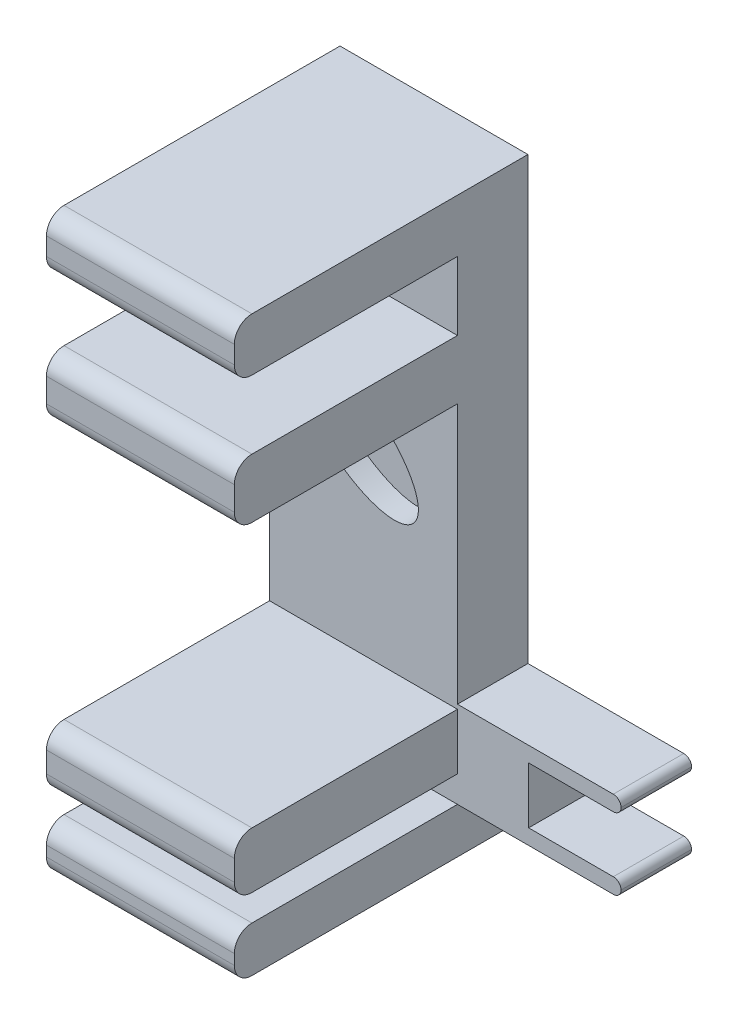
ISO-10303-21;
HEADER;
FILE_DESCRIPTION(('STEP AP214'),'2;1');
FILE_NAME('part.step','',(''),(''),'','','');
FILE_SCHEMA(('AUTOMOTIVE_DESIGN { 1 0 10303 214 1 1 1 1 }'));
ENDSEC;
DATA;
#1=APPLICATION_CONTEXT('core data for automotive mechanical design processes');
#2=APPLICATION_PROTOCOL_DEFINITION('international standard','automotive_design',2000,#1);
#3=PRODUCT_CONTEXT('',#1,'mechanical');
#4=PRODUCT('Part','Part','',(#3));
#5=PRODUCT_RELATED_PRODUCT_CATEGORY('part','',(#4));
#6=PRODUCT_DEFINITION_FORMATION('','',#4);
#7=PRODUCT_DEFINITION_CONTEXT('part definition',#1,'design');
#8=PRODUCT_DEFINITION('design','',#6,#7);
#9=PRODUCT_DEFINITION_SHAPE('','',#8);
#10=(LENGTH_UNIT() NAMED_UNIT(*) SI_UNIT(.MILLI.,.METRE.));
#11=(NAMED_UNIT(*) PLANE_ANGLE_UNIT() SI_UNIT($,.RADIAN.));
#12=(NAMED_UNIT(*) SI_UNIT($,.STERADIAN.) SOLID_ANGLE_UNIT());
#13=UNCERTAINTY_MEASURE_WITH_UNIT(LENGTH_MEASURE(1.E-05),#10,'distance_accuracy_value','');
#14=(GEOMETRIC_REPRESENTATION_CONTEXT(3) GLOBAL_UNCERTAINTY_ASSIGNED_CONTEXT((#13)) GLOBAL_UNIT_ASSIGNED_CONTEXT((#10,
#11,#12)) REPRESENTATION_CONTEXT('',''));
#15=CARTESIAN_POINT('',(0.,0.,0.));
#16=DIRECTION('',(0.,0.,1.));
#17=DIRECTION('',(1.,0.,0.));
#18=AXIS2_PLACEMENT_3D('',#15,#16,#17);
#19=CARTESIAN_POINT('',(0.,0.,15.));
#20=DIRECTION('',(0.,0.,1.));
#21=DIRECTION('',(1.,0.,0.));
#22=AXIS2_PLACEMENT_3D('',#19,#20,#21);
#23=PLANE('',#22);
#24=CARTESIAN_POINT('',(37.0689794079835,133.739472918689,15.));
#25=DIRECTION('',(0.,0.,1.));
#26=DIRECTION('',(0.778753909083282,-0.627329537872646,0.));
#27=AXIS2_PLACEMENT_3D('',#24,#25,#26);
#28=ELLIPSE('',#27,31.4602203387693,15.1854081794294);
#29=CARTESIAN_POINT('',(61.5687489774215,114.003547432197,15.));
#30=VERTEX_POINT('',#29);
#31=EDGE_CURVE('E620',#30,#30,#28,.T.);
#32=ORIENTED_EDGE('',*,*,#31,.F.);
#33=EDGE_LOOP('',(#32));
#34=FACE_BOUND('',#33,.T.);
#35=DIRECTION('',(0.,-1.,0.));
#36=VECTOR('',#35,1.);
#37=CARTESIAN_POINT('',(80.,0.,15.));
#38=LINE('',#37,#36);
#39=CARTESIAN_POINT('',(80.,54.4554963953684,15.));
#40=VERTEX_POINT('',#39);
#41=CARTESIAN_POINT('',(80.,30.636275980637,15.));
#42=VERTEX_POINT('',#41);
#43=EDGE_CURVE('E432',#40,#42,#38,.T.);
#44=ORIENTED_EDGE('',*,*,#43,.T.);
#45=DIRECTION('',(-1.,0.,0.));
#46=VECTOR('',#45,1.);
#47=CARTESIAN_POINT('',(0.,30.636275980637,15.));
#48=LINE('',#47,#46);
#49=CARTESIAN_POINT('',(0.,30.636275980637,15.));
#50=VERTEX_POINT('',#49);
#51=EDGE_CURVE('E282',#42,#50,#48,.T.);
#52=ORIENTED_EDGE('',*,*,#51,.T.);
#53=DIRECTION('',(0.,1.,0.));
#54=VECTOR('',#53,1.);
#55=CARTESIAN_POINT('',(0.,0.,15.));
#56=LINE('',#55,#54);
#57=CARTESIAN_POINT('',(0.,19.3895928088052,15.));
#58=VERTEX_POINT('',#57);
#59=EDGE_CURVE('E289',#58,#50,#56,.T.);
#60=ORIENTED_EDGE('',*,*,#59,.F.);
#61=DIRECTION('',(1.,0.,0.));
#62=VECTOR('',#61,1.);
#63=CARTESIAN_POINT('',(0.,19.3895928088052,15.));
#64=LINE('',#63,#62);
#65=CARTESIAN_POINT('',(80.,19.3895928088052,15.));
#66=VERTEX_POINT('',#65);
#67=EDGE_CURVE('E584',#58,#66,#64,.T.);
#68=ORIENTED_EDGE('',*,*,#67,.T.);
#69=DIRECTION('',(-1.,0.,0.));
#70=VECTOR('',#69,1.);
#71=CARTESIAN_POINT('',(0.,19.3895928088052,15.));
#72=LINE('',#71,#70);
#73=CARTESIAN_POINT('',(146.35,19.3895928088052,15.));
#74=VERTEX_POINT('',#73);
#75=EDGE_CURVE('E295',#74,#66,#72,.T.);
#76=ORIENTED_EDGE('',*,*,#75,.F.);
#77=CARTESIAN_POINT('',(146.35,22.7195928088052,15.));
#78=DIRECTION('',(0.,0.,1.));
#79=DIRECTION('',(1.,0.,0.));
#80=AXIS2_PLACEMENT_3D('',#77,#78,#79);
#81=CIRCLE('',#80,3.33);
#82=CARTESIAN_POINT('',(149.678914988401,22.6345928088052,15.));
#83=VERTEX_POINT('',#82);
#84=EDGE_CURVE('E407',#74,#83,#81,.T.);
#85=ORIENTED_EDGE('',*,*,#84,.T.);
#86=CARTESIAN_POINT('',(146.35,22.5495928088052,15.));
#87=DIRECTION('',(0.,0.,1.));
#88=DIRECTION('',(1.,0.,0.));
#89=AXIS2_PLACEMENT_3D('',#86,#87,#88);
#90=CIRCLE('',#89,3.33);
#91=CARTESIAN_POINT('',(146.35,25.8795928088052,15.));
#92=VERTEX_POINT('',#91);
#93=EDGE_CURVE('E404',#83,#92,#90,.T.);
#94=ORIENTED_EDGE('',*,*,#93,.T.);
#95=DIRECTION('',(1.,0.,0.));
#96=VECTOR('',#95,1.);
#97=CARTESIAN_POINT('',(0.,25.8795928088052,15.));
#98=LINE('',#97,#96);
#99=CARTESIAN_POINT('',(110.31,25.8795928088052,15.));
#100=VERTEX_POINT('',#99);
#101=EDGE_CURVE('E304',#100,#92,#98,.T.);
#102=ORIENTED_EDGE('',*,*,#101,.F.);
#103=DIRECTION('',(0.,-1.,0.));
#104=VECTOR('',#103,1.);
#105=CARTESIAN_POINT('',(110.31,0.,15.));
#106=LINE('',#105,#104);
#107=CARTESIAN_POINT('',(110.31,49.83,15.));
#108=VERTEX_POINT('',#107);
#109=EDGE_CURVE('E308',#108,#100,#106,.T.);
#110=ORIENTED_EDGE('',*,*,#109,.F.);
#111=DIRECTION('',(-1.,0.,0.));
#112=VECTOR('',#111,1.);
#113=CARTESIAN_POINT('',(0.,49.8299999999999,15.));
#114=LINE('',#113,#112);
#115=CARTESIAN_POINT('',(146.35,49.83,15.));
#116=VERTEX_POINT('',#115);
#117=EDGE_CURVE('E312',#116,#108,#114,.T.);
#118=ORIENTED_EDGE('',*,*,#117,.F.);
#119=CARTESIAN_POINT('',(146.35,53.16,15.));
#120=DIRECTION('',(0.,0.,1.));
#121=DIRECTION('',(1.,0.,0.));
#122=AXIS2_PLACEMENT_3D('',#119,#120,#121);
#123=CIRCLE('',#122,3.33);
#124=CARTESIAN_POINT('',(149.678914988401,53.075,15.));
#125=VERTEX_POINT('',#124);
#126=EDGE_CURVE('E401',#116,#125,#123,.T.);
#127=ORIENTED_EDGE('',*,*,#126,.T.);
#128=CARTESIAN_POINT('',(146.35,52.99,15.));
#129=DIRECTION('',(0.,0.,1.));
#130=DIRECTION('',(1.,0.,0.));
#131=AXIS2_PLACEMENT_3D('',#128,#129,#130);
#132=CIRCLE('',#131,3.33);
#133=CARTESIAN_POINT('',(146.35,56.32,15.));
#134=VERTEX_POINT('',#133);
#135=EDGE_CURVE('E398',#125,#134,#132,.T.);
#136=ORIENTED_EDGE('',*,*,#135,.T.);
#137=DIRECTION('',(1.,0.,0.));
#138=VECTOR('',#137,1.);
#139=CARTESIAN_POINT('',(0.,56.32,15.));
#140=LINE('',#139,#138);
#141=CARTESIAN_POINT('',(80.,56.32,15.));
#142=VERTEX_POINT('',#141);
#143=EDGE_CURVE('E315',#142,#134,#140,.T.);
#144=ORIENTED_EDGE('',*,*,#143,.F.);
#145=DIRECTION('',(0.,-1.,0.));
#146=VECTOR('',#145,1.);
#147=CARTESIAN_POINT('',(80.,0.,15.));
#148=LINE('',#147,#146);
#149=CARTESIAN_POINT('',(80.,167.086381499313,15.));
#150=VERTEX_POINT('',#149);
#151=EDGE_CURVE('E357',#150,#142,#148,.T.);
#152=ORIENTED_EDGE('',*,*,#151,.F.);
#153=DIRECTION('',(-1.,0.,0.));
#154=VECTOR('',#153,1.);
#155=CARTESIAN_POINT('',(0.,167.086381499313,15.));
#156=LINE('',#155,#154);
#157=CARTESIAN_POINT('',(0.,167.086381499313,15.));
#158=VERTEX_POINT('',#157);
#159=EDGE_CURVE('E287',#150,#158,#156,.T.);
#160=ORIENTED_EDGE('',*,*,#159,.T.);
#161=CARTESIAN_POINT('',(0.,54.4554963953684,15.));
#162=VERTEX_POINT('',#161);
#163=EDGE_CURVE('E264',#162,#158,#56,.T.);
#164=ORIENTED_EDGE('',*,*,#163,.F.);
#165=DIRECTION('',(1.,0.,0.));
#166=VECTOR('',#165,1.);
#167=CARTESIAN_POINT('',(0.,54.4554963953684,15.));
#168=LINE('',#167,#166);
#169=EDGE_CURVE('E275',#162,#40,#168,.T.);
#170=ORIENTED_EDGE('',*,*,#169,.T.);
#171=EDGE_LOOP('',(#44,#52,#60,#68,#76,#85,#94,#102,#110,#118,#127,#136,#144,#152,#160,#164,#170));
#172=FACE_BOUND('',#171,.T.);
#173=ADVANCED_FACE('F40',(#34,#172),#23,.T.);
#174=CARTESIAN_POINT('',(0.,192.266700223457,15.));
#175=VERTEX_POINT('',#174);
#176=CARTESIAN_POINT('',(0.,221.407750287354,15.));
#177=VERTEX_POINT('',#176);
#178=EDGE_CURVE('E290',#175,#177,#56,.T.);
#179=ORIENTED_EDGE('',*,*,#178,.F.);
#180=DIRECTION('',(1.,0.,0.));
#181=VECTOR('',#180,1.);
#182=CARTESIAN_POINT('',(0.,192.266700223457,15.));
#183=LINE('',#182,#181);
#184=CARTESIAN_POINT('',(80.,192.266700223457,15.));
#185=VERTEX_POINT('',#184);
#186=EDGE_CURVE('E560',#175,#185,#183,.T.);
#187=ORIENTED_EDGE('',*,*,#186,.T.);
#188=CARTESIAN_POINT('',(80.,221.407750287354,15.));
#189=VERTEX_POINT('',#188);
#190=EDGE_CURVE('E297',#189,#185,#148,.T.);
#191=ORIENTED_EDGE('',*,*,#190,.F.);
#192=DIRECTION('',(-1.,0.,0.));
#193=VECTOR('',#192,1.);
#194=CARTESIAN_POINT('',(0.,221.407750287354,15.));
#195=LINE('',#194,#193);
#196=EDGE_CURVE('E420',#189,#177,#195,.T.);
#197=ORIENTED_EDGE('',*,*,#196,.T.);
#198=EDGE_LOOP('',(#179,#187,#191,#197));
#199=FACE_BOUND('',#198,.T.);
#200=ADVANCED_FACE('F676',(#199),#23,.T.);
#201=CARTESIAN_POINT('',(80.,0.,15.));
#202=DIRECTION('',(1.,0.,0.));
#203=DIRECTION('',(0.,1.,0.));
#204=AXIS2_PLACEMENT_3D('',#201,#202,#203);
#205=PLANE('',#204);
#206=DIRECTION('',(0.,1.,0.));
#207=VECTOR('',#206,1.);
#208=CARTESIAN_POINT('',(80.,167.086381499313,110.));
#209=LINE('',#208,#207);
#210=CARTESIAN_POINT('',(80.,174.586381499313,110.));
#211=VERTEX_POINT('',#210);
#212=CARTESIAN_POINT('',(80.,184.766700223457,110.));
#213=VERTEX_POINT('',#212);
#214=EDGE_CURVE('E576',#211,#213,#209,.T.);
#215=ORIENTED_EDGE('',*,*,#214,.F.);
#216=CARTESIAN_POINT('',(80.,174.586381499313,102.5));
#217=DIRECTION('',(1.,0.,0.));
#218=DIRECTION('',(0.,1.,0.));
#219=AXIS2_PLACEMENT_3D('',#216,#217,#218);
#220=CIRCLE('',#219,7.5);
#221=CARTESIAN_POINT('',(80.,167.086381499313,102.5));
#222=VERTEX_POINT('',#221);
#223=EDGE_CURVE('E513',#211,#222,#220,.T.);
#224=ORIENTED_EDGE('',*,*,#223,.T.);
#225=DIRECTION('',(0.,0.,-1.));
#226=VECTOR('',#225,1.);
#227=CARTESIAN_POINT('',(80.,167.086381499313,110.));
#228=LINE('',#227,#226);
#229=EDGE_CURVE('E567',#222,#150,#228,.T.);
#230=ORIENTED_EDGE('',*,*,#229,.T.);
#231=ORIENTED_EDGE('',*,*,#151,.T.);
#232=DIRECTION('',(0.,0.,-1.));
#233=VECTOR('',#232,1.);
#234=CARTESIAN_POINT('',(80.,56.32,15.));
#235=LINE('',#234,#233);
#236=CARTESIAN_POINT('',(80.,56.32,-15.));
#237=VERTEX_POINT('',#236);
#238=EDGE_CURVE('E319',#142,#237,#235,.T.);
#239=ORIENTED_EDGE('',*,*,#238,.T.);
#240=DIRECTION('',(0.,-1.,0.));
#241=VECTOR('',#240,1.);
#242=CARTESIAN_POINT('',(80.,0.,-15.));
#243=LINE('',#242,#241);
#244=CARTESIAN_POINT('',(80.,244.,-15.));
#245=VERTEX_POINT('',#244);
#246=EDGE_CURVE('E320',#245,#237,#243,.T.);
#247=ORIENTED_EDGE('',*,*,#246,.F.);
#248=DIRECTION('',(0.,0.,-1.));
#249=VECTOR('',#248,1.);
#250=CARTESIAN_POINT('',(80.,244.,15.));
#251=LINE('',#250,#249);
#252=CARTESIAN_POINT('',(80.,244.,102.5));
#253=VERTEX_POINT('',#252);
#254=EDGE_CURVE('E379',#253,#245,#251,.T.);
#255=ORIENTED_EDGE('',*,*,#254,.F.);
#256=CARTESIAN_POINT('',(80.,236.5,102.5));
#257=DIRECTION('',(1.,0.,0.));
#258=DIRECTION('',(0.,1.,0.));
#259=AXIS2_PLACEMENT_3D('',#256,#257,#258);
#260=CIRCLE('',#259,7.5);
#261=CARTESIAN_POINT('',(80.,236.5,110.));
#262=VERTEX_POINT('',#261);
#263=EDGE_CURVE('E62',#253,#262,#260,.T.);
#264=ORIENTED_EDGE('',*,*,#263,.T.);
#265=DIRECTION('',(0.,1.,0.));
#266=VECTOR('',#265,1.);
#267=CARTESIAN_POINT('',(80.,0.,110.));
#268=LINE('',#267,#266);
#269=CARTESIAN_POINT('',(80.,228.907750287354,110.));
#270=VERTEX_POINT('',#269);
#271=EDGE_CURVE('E546',#270,#262,#268,.T.);
#272=ORIENTED_EDGE('',*,*,#271,.F.);
#273=CARTESIAN_POINT('',(80.,228.907750287354,102.5));
#274=DIRECTION('',(1.,0.,0.));
#275=DIRECTION('',(0.,1.,0.));
#276=AXIS2_PLACEMENT_3D('',#273,#274,#275);
#277=CIRCLE('',#276,7.5);
#278=CARTESIAN_POINT('',(80.,221.407750287354,102.5));
#279=VERTEX_POINT('',#278);
#280=EDGE_CURVE('E56',#270,#279,#277,.T.);
#281=ORIENTED_EDGE('',*,*,#280,.T.);
#282=DIRECTION('',(0.,0.,-1.));
#283=VECTOR('',#282,1.);
#284=CARTESIAN_POINT('',(80.,221.407750287354,110.));
#285=LINE('',#284,#283);
#286=EDGE_CURVE('E535',#279,#189,#285,.T.);
#287=ORIENTED_EDGE('',*,*,#286,.T.);
#288=ORIENTED_EDGE('',*,*,#190,.T.);
#289=DIRECTION('',(0.,0.,-1.));
#290=VECTOR('',#289,1.);
#291=CARTESIAN_POINT('',(80.,192.266700223457,110.));
#292=LINE('',#291,#290);
#293=CARTESIAN_POINT('',(80.,192.266700223457,102.5));
#294=VERTEX_POINT('',#293);
#295=EDGE_CURVE('E570',#294,#185,#292,.T.);
#296=ORIENTED_EDGE('',*,*,#295,.F.);
#297=CARTESIAN_POINT('',(80.,184.766700223457,102.5));
#298=DIRECTION('',(1.,0.,0.));
#299=DIRECTION('',(0.,1.,0.));
#300=AXIS2_PLACEMENT_3D('',#297,#298,#299);
#301=CIRCLE('',#300,7.5);
#302=EDGE_CURVE('E510',#294,#213,#301,.T.);
#303=ORIENTED_EDGE('',*,*,#302,.T.);
#304=EDGE_LOOP('',(#215,#224,#230,#231,#239,#247,#255,#264,#272,#281,#287,#288,#296,#303));
#305=FACE_BOUND('',#304,.T.);
#306=ADVANCED_FACE('F550',(#305),#205,.T.);
#307=CARTESIAN_POINT('',(0.,244.,15.));
#308=DIRECTION('',(0.,1.,0.));
#309=DIRECTION('',(0.,0.,1.));
#310=AXIS2_PLACEMENT_3D('',#307,#308,#309);
#311=PLANE('',#310);
#312=DIRECTION('',(0.,0.,-1.));
#313=VECTOR('',#312,1.);
#314=CARTESIAN_POINT('',(0.,244.,15.));
#315=LINE('',#314,#313);
#316=CARTESIAN_POINT('',(0.,244.,102.5));
#317=VERTEX_POINT('',#316);
#318=CARTESIAN_POINT('',(0.,244.,-15.));
#319=VERTEX_POINT('',#318);
#320=EDGE_CURVE('E376',#317,#319,#315,.T.);
#321=ORIENTED_EDGE('',*,*,#320,.F.);
#322=DIRECTION('',(-1.,0.,0.));
#323=VECTOR('',#322,1.);
#324=CARTESIAN_POINT('',(0.,244.,102.5));
#325=LINE('',#324,#323);
#326=EDGE_CURVE('E11',#317,#253,#325,.F.);
#327=ORIENTED_EDGE('',*,*,#326,.T.);
#328=ORIENTED_EDGE('',*,*,#254,.T.);
#329=DIRECTION('',(1.,0.,0.));
#330=VECTOR('',#329,1.);
#331=CARTESIAN_POINT('',(0.,244.,-15.));
#332=LINE('',#331,#330);
#333=EDGE_CURVE('E324',#319,#245,#332,.T.);
#334=ORIENTED_EDGE('',*,*,#333,.F.);
#335=EDGE_LOOP('',(#321,#327,#328,#334));
#336=FACE_BOUND('',#335,.T.);
#337=ADVANCED_FACE('F713',(#336),#311,.T.);
#338=CARTESIAN_POINT('',(0.,0.,15.));
#339=DIRECTION('',(-1.,0.,0.));
#340=DIRECTION('',(0.,0.,1.));
#341=AXIS2_PLACEMENT_3D('',#338,#339,#340);
#342=PLANE('',#341);
#343=DIRECTION('',(0.,0.,-1.));
#344=VECTOR('',#343,1.);
#345=CARTESIAN_POINT('',(0.,0.,15.));
#346=LINE('',#345,#344);
#347=CARTESIAN_POINT('',(0.,0.,102.5));
#348=VERTEX_POINT('',#347);
#349=CARTESIAN_POINT('',(0.,0.,-15.));
#350=VERTEX_POINT('',#349);
#351=EDGE_CURVE('E373',#348,#350,#346,.T.);
#352=ORIENTED_EDGE('',*,*,#351,.F.);
#353=CARTESIAN_POINT('',(0.,7.5,102.5));
#354=DIRECTION('',(-1.,0.,0.));
#355=DIRECTION('',(0.,0.,1.));
#356=AXIS2_PLACEMENT_3D('',#353,#354,#355);
#357=CIRCLE('',#356,7.5);
#358=CARTESIAN_POINT('',(0.,7.5,110.));
#359=VERTEX_POINT('',#358);
#360=EDGE_CURVE('E472',#348,#359,#357,.T.);
#361=ORIENTED_EDGE('',*,*,#360,.T.);
#362=DIRECTION('',(0.,-1.,0.));
#363=VECTOR('',#362,1.);
#364=CARTESIAN_POINT('',(0.,0.,110.));
#365=LINE('',#364,#363);
#366=CARTESIAN_POINT('',(0.,11.8895928088052,110.));
#367=VERTEX_POINT('',#366);
#368=EDGE_CURVE('E598',#367,#359,#365,.T.);
#369=ORIENTED_EDGE('',*,*,#368,.F.);
#370=CARTESIAN_POINT('',(0.,11.8895928088052,102.5));
#371=DIRECTION('',(-1.,0.,0.));
#372=DIRECTION('',(0.,0.,1.));
#373=AXIS2_PLACEMENT_3D('',#370,#371,#372);
#374=CIRCLE('',#373,7.5);
#375=CARTESIAN_POINT('',(0.,19.3895928088052,102.5));
#376=VERTEX_POINT('',#375);
#377=EDGE_CURVE('E469',#367,#376,#374,.T.);
#378=ORIENTED_EDGE('',*,*,#377,.T.);
#379=DIRECTION('',(0.,0.,-1.));
#380=VECTOR('',#379,1.);
#381=CARTESIAN_POINT('',(0.,19.3895928088052,110.));
#382=LINE('',#381,#380);
#383=EDGE_CURVE('E591',#376,#58,#382,.T.);
#384=ORIENTED_EDGE('',*,*,#383,.T.);
#385=ORIENTED_EDGE('',*,*,#59,.T.);
#386=DIRECTION('',(0.,0.,-1.));
#387=VECTOR('',#386,1.);
#388=CARTESIAN_POINT('',(0.,30.636275980637,110.));
#389=LINE('',#388,#387);
#390=CARTESIAN_POINT('',(0.,30.636275980637,102.5));
#391=VERTEX_POINT('',#390);
#392=EDGE_CURVE('E283',#391,#50,#389,.T.);
#393=ORIENTED_EDGE('',*,*,#392,.F.);
#394=CARTESIAN_POINT('',(0.,38.136275980637,102.5));
#395=DIRECTION('',(-1.,0.,0.));
#396=DIRECTION('',(0.,0.,1.));
#397=AXIS2_PLACEMENT_3D('',#394,#395,#396);
#398=CIRCLE('',#397,7.5);
#399=CARTESIAN_POINT('',(0.,38.136275980637,110.));
#400=VERTEX_POINT('',#399);
#401=EDGE_CURVE('E466',#391,#400,#398,.T.);
#402=ORIENTED_EDGE('',*,*,#401,.T.);
#403=DIRECTION('',(0.,-1.,0.));
#404=VECTOR('',#403,1.);
#405=CARTESIAN_POINT('',(0.,54.4554963953684,110.));
#406=LINE('',#405,#404);
#407=CARTESIAN_POINT('',(0.,46.9554963953684,110.));
#408=VERTEX_POINT('',#407);
#409=EDGE_CURVE('E615',#408,#400,#406,.T.);
#410=ORIENTED_EDGE('',*,*,#409,.F.);
#411=CARTESIAN_POINT('',(0.,46.9554963953684,102.5));
#412=DIRECTION('',(-1.,0.,0.));
#413=DIRECTION('',(0.,0.,1.));
#414=AXIS2_PLACEMENT_3D('',#411,#412,#413);
#415=CIRCLE('',#414,7.5);
#416=CARTESIAN_POINT('',(0.,54.4554963953684,102.5));
#417=VERTEX_POINT('',#416);
#418=EDGE_CURVE('E267',#408,#417,#415,.T.);
#419=ORIENTED_EDGE('',*,*,#418,.T.);
#420=DIRECTION('',(0.,0.,-1.));
#421=VECTOR('',#420,1.);
#422=CARTESIAN_POINT('',(0.,54.4554963953684,110.));
#423=LINE('',#422,#421);
#424=EDGE_CURVE('E258',#417,#162,#423,.T.);
#425=ORIENTED_EDGE('',*,*,#424,.T.);
#426=ORIENTED_EDGE('',*,*,#163,.T.);
#427=DIRECTION('',(0.,0.,-1.));
#428=VECTOR('',#427,1.);
#429=CARTESIAN_POINT('',(0.,167.086381499313,110.));
#430=LINE('',#429,#428);
#431=CARTESIAN_POINT('',(0.,167.086381499313,102.5));
#432=VERTEX_POINT('',#431);
#433=EDGE_CURVE('E564',#432,#158,#430,.T.);
#434=ORIENTED_EDGE('',*,*,#433,.F.);
#435=CARTESIAN_POINT('',(0.,174.586381499313,102.5));
#436=DIRECTION('',(-1.,0.,0.));
#437=DIRECTION('',(0.,0.,1.));
#438=AXIS2_PLACEMENT_3D('',#435,#436,#437);
#439=CIRCLE('',#438,7.5);
#440=CARTESIAN_POINT('',(0.,174.586381499313,110.));
#441=VERTEX_POINT('',#440);
#442=EDGE_CURVE('E461',#432,#441,#439,.T.);
#443=ORIENTED_EDGE('',*,*,#442,.T.);
#444=DIRECTION('',(0.,-1.,0.));
#445=VECTOR('',#444,1.);
#446=CARTESIAN_POINT('',(0.,167.086381499313,110.));
#447=LINE('',#446,#445);
#448=CARTESIAN_POINT('',(0.,184.766700223457,110.));
#449=VERTEX_POINT('',#448);
#450=EDGE_CURVE('E580',#449,#441,#447,.T.);
#451=ORIENTED_EDGE('',*,*,#450,.F.);
#452=CARTESIAN_POINT('',(0.,184.766700223457,102.5));
#453=DIRECTION('',(-1.,0.,0.));
#454=DIRECTION('',(0.,0.,1.));
#455=AXIS2_PLACEMENT_3D('',#452,#453,#454);
#456=CIRCLE('',#455,7.5);
#457=CARTESIAN_POINT('',(0.,192.266700223457,102.5));
#458=VERTEX_POINT('',#457);
#459=EDGE_CURVE('E458',#449,#458,#456,.T.);
#460=ORIENTED_EDGE('',*,*,#459,.T.);
#461=DIRECTION('',(0.,0.,-1.));
#462=VECTOR('',#461,1.);
#463=CARTESIAN_POINT('',(0.,192.266700223457,110.));
#464=LINE('',#463,#462);
#465=EDGE_CURVE('E573',#458,#175,#464,.T.);
#466=ORIENTED_EDGE('',*,*,#465,.T.);
#467=ORIENTED_EDGE('',*,*,#178,.T.);
#468=DIRECTION('',(0.,0.,-1.));
#469=VECTOR('',#468,1.);
#470=CARTESIAN_POINT('',(0.,221.407750287354,110.));
#471=LINE('',#470,#469);
#472=CARTESIAN_POINT('',(0.,221.407750287354,102.5));
#473=VERTEX_POINT('',#472);
#474=EDGE_CURVE('E428',#473,#177,#471,.T.);
#475=ORIENTED_EDGE('',*,*,#474,.F.);
#476=CARTESIAN_POINT('',(0.,228.907750287354,102.5));
#477=DIRECTION('',(-1.,0.,0.));
#478=DIRECTION('',(0.,0.,1.));
#479=AXIS2_PLACEMENT_3D('',#476,#477,#478);
#480=CIRCLE('',#479,7.5);
#481=CARTESIAN_POINT('',(0.,228.907750287354,110.));
#482=VERTEX_POINT('',#481);
#483=EDGE_CURVE('E455',#473,#482,#480,.T.);
#484=ORIENTED_EDGE('',*,*,#483,.T.);
#485=DIRECTION('',(0.,1.,0.));
#486=VECTOR('',#485,1.);
#487=CARTESIAN_POINT('',(0.,0.,110.));
#488=LINE('',#487,#486);
#489=CARTESIAN_POINT('',(0.,236.5,110.));
#490=VERTEX_POINT('',#489);
#491=EDGE_CURVE('E548',#482,#490,#488,.T.);
#492=ORIENTED_EDGE('',*,*,#491,.T.);
#493=CARTESIAN_POINT('',(0.,236.5,102.5));
#494=DIRECTION('',(-1.,0.,0.));
#495=DIRECTION('',(0.,0.,1.));
#496=AXIS2_PLACEMENT_3D('',#493,#494,#495);
#497=CIRCLE('',#496,7.5);
#498=EDGE_CURVE('E452',#490,#317,#497,.T.);
#499=ORIENTED_EDGE('',*,*,#498,.T.);
#500=ORIENTED_EDGE('',*,*,#320,.T.);
#501=DIRECTION('',(0.,1.,0.));
#502=VECTOR('',#501,1.);
#503=CARTESIAN_POINT('',(0.,0.,-15.));
#504=LINE('',#503,#502);
#505=EDGE_CURVE('E330',#350,#319,#504,.T.);
#506=ORIENTED_EDGE('',*,*,#505,.F.);
#507=EDGE_LOOP('',(#352,#361,#369,#378,#384,#385,#393,#402,#410,#419,#425,#426,#434,#443,#451,
#460,#466,#467,#475,#484,#492,#499,#500,#506));
#508=FACE_BOUND('',#507,.T.);
#509=ADVANCED_FACE('F261',(#508),#342,.T.);
#510=CARTESIAN_POINT('',(0.,0.,15.));
#511=DIRECTION('',(0.,1.,0.));
#512=DIRECTION('',(0.,0.,1.));
#513=AXIS2_PLACEMENT_3D('',#510,#511,#512);
#514=PLANE('',#513);
#515=DIRECTION('',(0.,0.,-1.));
#516=VECTOR('',#515,1.);
#517=CARTESIAN_POINT('',(80.,0.,15.));
#518=LINE('',#517,#516);
#519=CARTESIAN_POINT('',(80.,0.,102.5));
#520=VERTEX_POINT('',#519);
#521=CARTESIAN_POINT('',(80.,0.,-15.));
#522=VERTEX_POINT('',#521);
#523=EDGE_CURVE('E370',#520,#522,#518,.T.);
#524=ORIENTED_EDGE('',*,*,#523,.F.);
#525=DIRECTION('',(1.,0.,0.));
#526=VECTOR('',#525,1.);
#527=CARTESIAN_POINT('',(0.,0.,102.5));
#528=LINE('',#527,#526);
#529=EDGE_CURVE('E449',#520,#348,#528,.F.);
#530=ORIENTED_EDGE('',*,*,#529,.T.);
#531=ORIENTED_EDGE('',*,*,#351,.T.);
#532=DIRECTION('',(1.,0.,0.));
#533=VECTOR('',#532,1.);
#534=CARTESIAN_POINT('',(0.,0.,-15.));
#535=LINE('',#534,#533);
#536=EDGE_CURVE('E334',#350,#522,#535,.T.);
#537=ORIENTED_EDGE('',*,*,#536,.T.);
#538=EDGE_LOOP('',(#524,#530,#531,#537));
#539=FACE_BOUND('',#538,.T.);
#540=ADVANCED_FACE('F706',(#539),#514,.F.);
#541=DIRECTION('',(0.,1.,0.));
#542=VECTOR('',#541,1.);
#543=CARTESIAN_POINT('',(80.,0.,110.));
#544=LINE('',#543,#542);
#545=CARTESIAN_POINT('',(80.,7.5,110.));
#546=VERTEX_POINT('',#545);
#547=CARTESIAN_POINT('',(80.,11.8895928088052,110.));
#548=VERTEX_POINT('',#547);
#549=EDGE_CURVE('E594',#546,#548,#544,.T.);
#550=ORIENTED_EDGE('',*,*,#549,.F.);
#551=CARTESIAN_POINT('',(80.,7.5,102.5));
#552=DIRECTION('',(1.,0.,0.));
#553=DIRECTION('',(0.,1.,0.));
#554=AXIS2_PLACEMENT_3D('',#551,#552,#553);
#555=CIRCLE('',#554,7.5);
#556=EDGE_CURVE('E446',#546,#520,#555,.T.);
#557=ORIENTED_EDGE('',*,*,#556,.T.);
#558=ORIENTED_EDGE('',*,*,#523,.T.);
#559=CARTESIAN_POINT('',(80.,19.3895928088052,-15.));
#560=VERTEX_POINT('',#559);
#561=EDGE_CURVE('E326',#560,#522,#243,.T.);
#562=ORIENTED_EDGE('',*,*,#561,.F.);
#563=DIRECTION('',(0.,0.,-1.));
#564=VECTOR('',#563,1.);
#565=CARTESIAN_POINT('',(80.,19.3895928088052,15.));
#566=LINE('',#565,#564);
#567=EDGE_CURVE('E367',#66,#560,#566,.T.);
#568=ORIENTED_EDGE('',*,*,#567,.F.);
#569=DIRECTION('',(0.,0.,-1.));
#570=VECTOR('',#569,1.);
#571=CARTESIAN_POINT('',(80.,19.3895928088052,110.));
#572=LINE('',#571,#570);
#573=CARTESIAN_POINT('',(80.,19.3895928088052,102.5));
#574=VERTEX_POINT('',#573);
#575=EDGE_CURVE('E588',#574,#66,#572,.T.);
#576=ORIENTED_EDGE('',*,*,#575,.F.);
#577=CARTESIAN_POINT('',(80.,11.8895928088052,102.5));
#578=DIRECTION('',(1.,0.,0.));
#579=DIRECTION('',(0.,1.,0.));
#580=AXIS2_PLACEMENT_3D('',#577,#578,#579);
#581=CIRCLE('',#580,7.5);
#582=EDGE_CURVE('E443',#574,#548,#581,.T.);
#583=ORIENTED_EDGE('',*,*,#582,.T.);
#584=EDGE_LOOP('',(#550,#557,#558,#562,#568,#576,#583));
#585=FACE_BOUND('',#584,.T.);
#586=ADVANCED_FACE('F702',(#585),#205,.T.);
#587=CARTESIAN_POINT('',(0.,19.3895928088052,15.));
#588=DIRECTION('',(0.,-1.,0.));
#589=DIRECTION('',(1.,0.,0.));
#590=AXIS2_PLACEMENT_3D('',#587,#588,#589);
#591=PLANE('',#590);
#592=DIRECTION('',(-1.,0.,0.));
#593=VECTOR('',#592,1.);
#594=CARTESIAN_POINT('',(0.,19.3895928088052,-15.));
#595=LINE('',#594,#593);
#596=CARTESIAN_POINT('',(146.35,19.3895928088052,-15.));
#597=VERTEX_POINT('',#596);
#598=EDGE_CURVE('E338',#597,#560,#595,.T.);
#599=ORIENTED_EDGE('',*,*,#598,.F.);
#600=DIRECTION('',(0.,0.,-1.));
#601=VECTOR('',#600,1.);
#602=CARTESIAN_POINT('',(146.35,19.3895928088052,15.));
#603=LINE('',#602,#601);
#604=EDGE_CURVE('E394',#597,#74,#603,.F.);
#605=ORIENTED_EDGE('',*,*,#604,.T.);
#606=ORIENTED_EDGE('',*,*,#75,.T.);
#607=ORIENTED_EDGE('',*,*,#567,.T.);
#608=EDGE_LOOP('',(#599,#605,#606,#607));
#609=FACE_BOUND('',#608,.T.);
#610=ADVANCED_FACE('F698',(#609),#591,.T.);
#611=CARTESIAN_POINT('',(0.,25.8795928088052,15.));
#612=DIRECTION('',(0.,1.,0.));
#613=DIRECTION('',(0.,0.,1.));
#614=AXIS2_PLACEMENT_3D('',#611,#612,#613);
#615=PLANE('',#614);
#616=ORIENTED_EDGE('',*,*,#101,.T.);
#617=DIRECTION('',(0.,0.,-1.));
#618=VECTOR('',#617,1.);
#619=CARTESIAN_POINT('',(146.35,25.8795928088052,15.));
#620=LINE('',#619,#618);
#621=CARTESIAN_POINT('',(146.35,25.8795928088052,-15.));
#622=VERTEX_POINT('',#621);
#623=EDGE_CURVE('E410',#92,#622,#620,.T.);
#624=ORIENTED_EDGE('',*,*,#623,.T.);
#625=DIRECTION('',(1.,0.,0.));
#626=VECTOR('',#625,1.);
#627=CARTESIAN_POINT('',(0.,25.8795928088052,-15.));
#628=LINE('',#627,#626);
#629=CARTESIAN_POINT('',(110.31,25.8795928088052,-15.));
#630=VERTEX_POINT('',#629);
#631=EDGE_CURVE('E342',#630,#622,#628,.T.);
#632=ORIENTED_EDGE('',*,*,#631,.F.);
#633=DIRECTION('',(0.,0.,-1.));
#634=VECTOR('',#633,1.);
#635=CARTESIAN_POINT('',(110.31,25.8795928088052,15.));
#636=LINE('',#635,#634);
#637=EDGE_CURVE('E364',#100,#630,#636,.T.);
#638=ORIENTED_EDGE('',*,*,#637,.F.);
#639=EDGE_LOOP('',(#616,#624,#632,#638));
#640=FACE_BOUND('',#639,.T.);
#641=ADVANCED_FACE('F694',(#640),#615,.T.);
#642=CARTESIAN_POINT('',(110.31,0.,15.));
#643=DIRECTION('',(1.,0.,0.));
#644=DIRECTION('',(0.,0.,-1.));
#645=AXIS2_PLACEMENT_3D('',#642,#643,#644);
#646=PLANE('',#645);
#647=DIRECTION('',(0.,-1.,0.));
#648=VECTOR('',#647,1.);
#649=CARTESIAN_POINT('',(110.31,0.,-15.));
#650=LINE('',#649,#648);
#651=CARTESIAN_POINT('',(110.31,49.83,-15.));
#652=VERTEX_POINT('',#651);
#653=EDGE_CURVE('E346',#652,#630,#650,.T.);
#654=ORIENTED_EDGE('',*,*,#653,.F.);
#655=DIRECTION('',(0.,0.,-1.));
#656=VECTOR('',#655,1.);
#657=CARTESIAN_POINT('',(110.31,49.83,15.));
#658=LINE('',#657,#656);
#659=EDGE_CURVE('E360',#108,#652,#658,.T.);
#660=ORIENTED_EDGE('',*,*,#659,.F.);
#661=ORIENTED_EDGE('',*,*,#109,.T.);
#662=ORIENTED_EDGE('',*,*,#637,.T.);
#663=EDGE_LOOP('',(#654,#660,#661,#662));
#664=FACE_BOUND('',#663,.T.);
#665=ADVANCED_FACE('F690',(#664),#646,.T.);
#666=CARTESIAN_POINT('',(0.,49.8299999999999,15.));
#667=DIRECTION('',(0.,-1.,0.));
#668=DIRECTION('',(1.,0.,0.));
#669=AXIS2_PLACEMENT_3D('',#666,#667,#668);
#670=PLANE('',#669);
#671=DIRECTION('',(-1.,0.,0.));
#672=VECTOR('',#671,1.);
#673=CARTESIAN_POINT('',(0.,49.8299999999999,-15.));
#674=LINE('',#673,#672);
#675=CARTESIAN_POINT('',(146.35,49.83,-15.));
#676=VERTEX_POINT('',#675);
#677=EDGE_CURVE('E350',#676,#652,#674,.T.);
#678=ORIENTED_EDGE('',*,*,#677,.F.);
#679=DIRECTION('',(0.,0.,-1.));
#680=VECTOR('',#679,1.);
#681=CARTESIAN_POINT('',(146.35,49.83,15.));
#682=LINE('',#681,#680);
#683=EDGE_CURVE('E413',#676,#116,#682,.F.);
#684=ORIENTED_EDGE('',*,*,#683,.T.);
#685=ORIENTED_EDGE('',*,*,#117,.T.);
#686=ORIENTED_EDGE('',*,*,#659,.T.);
#687=EDGE_LOOP('',(#678,#684,#685,#686));
#688=FACE_BOUND('',#687,.T.);
#689=ADVANCED_FACE('F686',(#688),#670,.T.);
#690=CARTESIAN_POINT('',(0.,56.32,15.));
#691=DIRECTION('',(0.,1.,0.));
#692=DIRECTION('',(0.,0.,1.));
#693=AXIS2_PLACEMENT_3D('',#690,#691,#692);
#694=PLANE('',#693);
#695=ORIENTED_EDGE('',*,*,#143,.T.);
#696=DIRECTION('',(0.,0.,-1.));
#697=VECTOR('',#696,1.);
#698=CARTESIAN_POINT('',(146.35,56.32,15.));
#699=LINE('',#698,#697);
#700=CARTESIAN_POINT('',(146.35,56.32,-15.));
#701=VERTEX_POINT('',#700);
#702=EDGE_CURVE('E417',#134,#701,#699,.T.);
#703=ORIENTED_EDGE('',*,*,#702,.T.);
#704=DIRECTION('',(1.,0.,0.));
#705=VECTOR('',#704,1.);
#706=CARTESIAN_POINT('',(0.,56.32,-15.));
#707=LINE('',#706,#705);
#708=EDGE_CURVE('E353',#237,#701,#707,.T.);
#709=ORIENTED_EDGE('',*,*,#708,.F.);
#710=ORIENTED_EDGE('',*,*,#238,.F.);
#711=EDGE_LOOP('',(#695,#703,#709,#710));
#712=FACE_BOUND('',#711,.T.);
#713=ADVANCED_FACE('F682',(#712),#694,.T.);
#714=CARTESIAN_POINT('',(0.,0.,-15.));
#715=DIRECTION('',(0.,0.,1.));
#716=DIRECTION('',(1.,0.,0.));
#717=AXIS2_PLACEMENT_3D('',#714,#715,#716);
#718=PLANE('',#717);
#719=CARTESIAN_POINT('',(146.35,22.5495928088052,-15.));
#720=DIRECTION('',(0.,0.,1.));
#721=DIRECTION('',(1.,0.,0.));
#722=AXIS2_PLACEMENT_3D('',#719,#720,#721);
#723=CIRCLE('',#722,3.33);
#724=CARTESIAN_POINT('',(149.678914988401,22.6345928088052,-15.));
#725=VERTEX_POINT('',#724);
#726=EDGE_CURVE('E388',#622,#725,#723,.F.);
#727=ORIENTED_EDGE('',*,*,#726,.T.);
#728=CARTESIAN_POINT('',(146.35,22.7195928088052,-15.));
#729=DIRECTION('',(0.,0.,1.));
#730=DIRECTION('',(1.,0.,0.));
#731=AXIS2_PLACEMENT_3D('',#728,#729,#730);
#732=CIRCLE('',#731,3.33);
#733=EDGE_CURVE('E391',#725,#597,#732,.F.);
#734=ORIENTED_EDGE('',*,*,#733,.T.);
#735=ORIENTED_EDGE('',*,*,#598,.T.);
#736=ORIENTED_EDGE('',*,*,#561,.T.);
#737=ORIENTED_EDGE('',*,*,#536,.F.);
#738=ORIENTED_EDGE('',*,*,#505,.T.);
#739=ORIENTED_EDGE('',*,*,#333,.T.);
#740=ORIENTED_EDGE('',*,*,#246,.T.);
#741=ORIENTED_EDGE('',*,*,#708,.T.);
#742=CARTESIAN_POINT('',(146.35,52.99,-15.));
#743=DIRECTION('',(0.,0.,1.));
#744=DIRECTION('',(1.,0.,0.));
#745=AXIS2_PLACEMENT_3D('',#742,#743,#744);
#746=CIRCLE('',#745,3.33);
#747=CARTESIAN_POINT('',(149.678914988401,53.075,-15.));
#748=VERTEX_POINT('',#747);
#749=EDGE_CURVE('E382',#701,#748,#746,.F.);
#750=ORIENTED_EDGE('',*,*,#749,.T.);
#751=CARTESIAN_POINT('',(146.35,53.16,-15.));
#752=DIRECTION('',(0.,0.,1.));
#753=DIRECTION('',(1.,0.,0.));
#754=AXIS2_PLACEMENT_3D('',#751,#752,#753);
#755=CIRCLE('',#754,3.33);
#756=EDGE_CURVE('E385',#748,#676,#755,.F.);
#757=ORIENTED_EDGE('',*,*,#756,.T.);
#758=ORIENTED_EDGE('',*,*,#677,.T.);
#759=ORIENTED_EDGE('',*,*,#653,.T.);
#760=ORIENTED_EDGE('',*,*,#631,.T.);
#761=EDGE_LOOP('',(#727,#734,#735,#736,#737,#738,#739,#740,#741,#750,#757,#758,#759,#760));
#762=FACE_BOUND('',#761,.T.);
#763=ADVANCED_FACE('F678',(#762),#718,.F.);
#764=CARTESIAN_POINT('',(146.35,22.5495928088052,15.));
#765=DIRECTION('',(0.,0.,-1.));
#766=DIRECTION('',(-1.,0.,0.));
#767=AXIS2_PLACEMENT_3D('',#764,#765,#766);
#768=CYLINDRICAL_SURFACE('',#767,3.33);
#769=ORIENTED_EDGE('',*,*,#623,.F.);
#770=ORIENTED_EDGE('',*,*,#93,.F.);
#771=DIRECTION('',(0.,0.,-1.));
#772=VECTOR('',#771,1.);
#773=CARTESIAN_POINT('',(149.678914988401,22.6345928088052,0.));
#774=LINE('',#773,#772);
#775=EDGE_CURVE('E325',#725,#83,#774,.F.);
#776=ORIENTED_EDGE('',*,*,#775,.F.);
#777=ORIENTED_EDGE('',*,*,#726,.F.);
#778=EDGE_LOOP('',(#769,#770,#776,#777));
#779=FACE_BOUND('',#778,.T.);
#780=ADVANCED_FACE('F681',(#779),#768,.T.);
#781=CARTESIAN_POINT('',(146.35,22.7195928088052,15.));
#782=DIRECTION('',(0.,0.,-1.));
#783=DIRECTION('',(-1.,0.,0.));
#784=AXIS2_PLACEMENT_3D('',#781,#782,#783);
#785=CYLINDRICAL_SURFACE('',#784,3.33);
#786=ORIENTED_EDGE('',*,*,#84,.F.);
#787=ORIENTED_EDGE('',*,*,#604,.F.);
#788=ORIENTED_EDGE('',*,*,#733,.F.);
#789=ORIENTED_EDGE('',*,*,#775,.T.);
#790=EDGE_LOOP('',(#786,#787,#788,#789));
#791=FACE_BOUND('',#790,.T.);
#792=ADVANCED_FACE('F717',(#791),#785,.T.);
#793=CARTESIAN_POINT('',(146.35,52.99,15.));
#794=DIRECTION('',(0.,0.,-1.));
#795=DIRECTION('',(-1.,0.,0.));
#796=AXIS2_PLACEMENT_3D('',#793,#794,#795);
#797=CYLINDRICAL_SURFACE('',#796,3.33);
#798=ORIENTED_EDGE('',*,*,#702,.F.);
#799=ORIENTED_EDGE('',*,*,#135,.F.);
#800=DIRECTION('',(0.,0.,-1.));
#801=VECTOR('',#800,1.);
#802=CARTESIAN_POINT('',(149.678914988401,53.075,0.));
#803=LINE('',#802,#801);
#804=EDGE_CURVE('E424',#748,#125,#803,.F.);
#805=ORIENTED_EDGE('',*,*,#804,.F.);
#806=ORIENTED_EDGE('',*,*,#749,.F.);
#807=EDGE_LOOP('',(#798,#799,#805,#806));
#808=FACE_BOUND('',#807,.T.);
#809=ADVANCED_FACE('F720',(#808),#797,.T.);
#810=CARTESIAN_POINT('',(146.35,53.16,15.));
#811=DIRECTION('',(0.,0.,-1.));
#812=DIRECTION('',(-1.,0.,0.));
#813=AXIS2_PLACEMENT_3D('',#810,#811,#812);
#814=CYLINDRICAL_SURFACE('',#813,3.33);
#815=ORIENTED_EDGE('',*,*,#126,.F.);
#816=ORIENTED_EDGE('',*,*,#683,.F.);
#817=ORIENTED_EDGE('',*,*,#756,.F.);
#818=ORIENTED_EDGE('',*,*,#804,.T.);
#819=EDGE_LOOP('',(#815,#816,#817,#818));
#820=FACE_BOUND('',#819,.T.);
#821=ADVANCED_FACE('F673',(#820),#814,.T.);
#822=CARTESIAN_POINT('',(0.,221.407750287354,110.));
#823=DIRECTION('',(0.,1.,0.));
#824=DIRECTION('',(0.,0.,1.));
#825=AXIS2_PLACEMENT_3D('',#822,#823,#824);
#826=PLANE('',#825);
#827=ORIENTED_EDGE('',*,*,#286,.F.);
#828=DIRECTION('',(1.,0.,0.));
#829=VECTOR('',#828,1.);
#830=CARTESIAN_POINT('',(0.,221.407750287354,102.5));
#831=LINE('',#830,#829);
#832=EDGE_CURVE('E49',#279,#473,#831,.F.);
#833=ORIENTED_EDGE('',*,*,#832,.T.);
#834=ORIENTED_EDGE('',*,*,#474,.T.);
#835=ORIENTED_EDGE('',*,*,#196,.F.);
#836=EDGE_LOOP('',(#827,#833,#834,#835));
#837=FACE_BOUND('',#836,.T.);
#838=ADVANCED_FACE('F533',(#837),#826,.F.);
#839=CARTESIAN_POINT('',(0.,0.,110.));
#840=DIRECTION('',(0.,0.,1.));
#841=DIRECTION('',(1.,0.,0.));
#842=AXIS2_PLACEMENT_3D('',#839,#840,#841);
#843=PLANE('',#842);
#844=ORIENTED_EDGE('',*,*,#491,.F.);
#845=DIRECTION('',(1.,0.,0.));
#846=VECTOR('',#845,1.);
#847=CARTESIAN_POINT('',(80.,228.907750287354,110.));
#848=LINE('',#847,#846);
#849=EDGE_CURVE('E526',#482,#270,#848,.T.);
#850=ORIENTED_EDGE('',*,*,#849,.T.);
#851=ORIENTED_EDGE('',*,*,#271,.T.);
#852=DIRECTION('',(-1.,0.,0.));
#853=VECTOR('',#852,1.);
#854=CARTESIAN_POINT('',(0.,236.5,110.));
#855=LINE('',#854,#853);
#856=EDGE_CURVE('E522',#262,#490,#855,.T.);
#857=ORIENTED_EDGE('',*,*,#856,.T.);
#858=EDGE_LOOP('',(#844,#850,#851,#857));
#859=FACE_BOUND('',#858,.T.);
#860=ADVANCED_FACE('F545',(#859),#843,.T.);
#861=CARTESIAN_POINT('',(0.,167.086381499313,110.));
#862=DIRECTION('',(0.,1.,0.));
#863=DIRECTION('',(0.,0.,1.));
#864=AXIS2_PLACEMENT_3D('',#861,#862,#863);
#865=PLANE('',#864);
#866=ORIENTED_EDGE('',*,*,#229,.F.);
#867=DIRECTION('',(1.,0.,0.));
#868=VECTOR('',#867,1.);
#869=CARTESIAN_POINT('',(0.,167.086381499313,102.5));
#870=LINE('',#869,#868);
#871=EDGE_CURVE('E516',#222,#432,#870,.F.);
#872=ORIENTED_EDGE('',*,*,#871,.T.);
#873=ORIENTED_EDGE('',*,*,#433,.T.);
#874=ORIENTED_EDGE('',*,*,#159,.F.);
#875=EDGE_LOOP('',(#866,#872,#873,#874));
#876=FACE_BOUND('',#875,.T.);
#877=ADVANCED_FACE('F664',(#876),#865,.F.);
#878=CARTESIAN_POINT('',(0.,192.266700223457,110.));
#879=DIRECTION('',(0.,-1.,0.));
#880=DIRECTION('',(0.,0.,-1.));
#881=AXIS2_PLACEMENT_3D('',#878,#879,#880);
#882=PLANE('',#881);
#883=ORIENTED_EDGE('',*,*,#465,.F.);
#884=DIRECTION('',(-1.,0.,0.));
#885=VECTOR('',#884,1.);
#886=CARTESIAN_POINT('',(0.,192.266700223457,102.5));
#887=LINE('',#886,#885);
#888=EDGE_CURVE('E519',#458,#294,#887,.F.);
#889=ORIENTED_EDGE('',*,*,#888,.T.);
#890=ORIENTED_EDGE('',*,*,#295,.T.);
#891=ORIENTED_EDGE('',*,*,#186,.F.);
#892=EDGE_LOOP('',(#883,#889,#890,#891));
#893=FACE_BOUND('',#892,.T.);
#894=ADVANCED_FACE('F660',(#893),#882,.F.);
#895=CARTESIAN_POINT('',(0.,0.,110.));
#896=DIRECTION('',(0.,0.,-1.));
#897=DIRECTION('',(-1.,0.,0.));
#898=AXIS2_PLACEMENT_3D('',#895,#896,#897);
#899=PLANE('',#898);
#900=ORIENTED_EDGE('',*,*,#450,.T.);
#901=DIRECTION('',(1.,0.,0.));
#902=VECTOR('',#901,1.);
#903=CARTESIAN_POINT('',(0.,174.586381499313,110.));
#904=LINE('',#903,#902);
#905=EDGE_CURVE('E502',#441,#211,#904,.T.);
#906=ORIENTED_EDGE('',*,*,#905,.T.);
#907=ORIENTED_EDGE('',*,*,#214,.T.);
#908=DIRECTION('',(-1.,0.,0.));
#909=VECTOR('',#908,1.);
#910=CARTESIAN_POINT('',(0.,184.766700223457,110.));
#911=LINE('',#910,#909);
#912=EDGE_CURVE('E498',#213,#449,#911,.T.);
#913=ORIENTED_EDGE('',*,*,#912,.T.);
#914=EDGE_LOOP('',(#900,#906,#907,#913));
#915=FACE_BOUND('',#914,.T.);
#916=ADVANCED_FACE('F656',(#915),#899,.F.);
#917=CARTESIAN_POINT('',(0.,19.3895928088052,110.));
#918=DIRECTION('',(0.,-1.,0.));
#919=DIRECTION('',(0.,0.,-1.));
#920=AXIS2_PLACEMENT_3D('',#917,#918,#919);
#921=PLANE('',#920);
#922=ORIENTED_EDGE('',*,*,#383,.F.);
#923=DIRECTION('',(-1.,0.,0.));
#924=VECTOR('',#923,1.);
#925=CARTESIAN_POINT('',(0.,19.3895928088052,102.5));
#926=LINE('',#925,#924);
#927=EDGE_CURVE('E475',#376,#574,#926,.F.);
#928=ORIENTED_EDGE('',*,*,#927,.T.);
#929=ORIENTED_EDGE('',*,*,#575,.T.);
#930=ORIENTED_EDGE('',*,*,#67,.F.);
#931=EDGE_LOOP('',(#922,#928,#929,#930));
#932=FACE_BOUND('',#931,.T.);
#933=ADVANCED_FACE('F652',(#932),#921,.F.);
#934=CARTESIAN_POINT('',(0.,0.,110.));
#935=DIRECTION('',(0.,0.,-1.));
#936=DIRECTION('',(-1.,0.,0.));
#937=AXIS2_PLACEMENT_3D('',#934,#935,#936);
#938=PLANE('',#937);
#939=ORIENTED_EDGE('',*,*,#368,.T.);
#940=DIRECTION('',(1.,0.,0.));
#941=VECTOR('',#940,1.);
#942=CARTESIAN_POINT('',(0.,7.5,110.));
#943=LINE('',#942,#941);
#944=EDGE_CURVE('E439',#359,#546,#943,.T.);
#945=ORIENTED_EDGE('',*,*,#944,.T.);
#946=ORIENTED_EDGE('',*,*,#549,.T.);
#947=DIRECTION('',(-1.,0.,0.));
#948=VECTOR('',#947,1.);
#949=CARTESIAN_POINT('',(0.,11.8895928088052,110.));
#950=LINE('',#949,#948);
#951=EDGE_CURVE('E435',#548,#367,#950,.T.);
#952=ORIENTED_EDGE('',*,*,#951,.T.);
#953=EDGE_LOOP('',(#939,#945,#946,#952));
#954=FACE_BOUND('',#953,.T.);
#955=ADVANCED_FACE('F648',(#954),#938,.F.);
#956=CARTESIAN_POINT('',(0.,30.636275980637,110.));
#957=DIRECTION('',(0.,1.,0.));
#958=DIRECTION('',(0.,0.,1.));
#959=AXIS2_PLACEMENT_3D('',#956,#957,#958);
#960=PLANE('',#959);
#961=DIRECTION('',(0.,0.,-1.));
#962=VECTOR('',#961,1.);
#963=CARTESIAN_POINT('',(80.,30.636275980637,110.));
#964=LINE('',#963,#962);
#965=CARTESIAN_POINT('',(80.,30.636275980637,102.5));
#966=VERTEX_POINT('',#965);
#967=EDGE_CURVE('E607',#966,#42,#964,.T.);
#968=ORIENTED_EDGE('',*,*,#967,.F.);
#969=DIRECTION('',(1.,0.,0.));
#970=VECTOR('',#969,1.);
#971=CARTESIAN_POINT('',(0.,30.636275980637,102.5));
#972=LINE('',#971,#970);
#973=EDGE_CURVE('E492',#966,#391,#972,.F.);
#974=ORIENTED_EDGE('',*,*,#973,.T.);
#975=ORIENTED_EDGE('',*,*,#392,.T.);
#976=ORIENTED_EDGE('',*,*,#51,.F.);
#977=EDGE_LOOP('',(#968,#974,#975,#976));
#978=FACE_BOUND('',#977,.T.);
#979=ADVANCED_FACE('F644',(#978),#960,.F.);
#980=CARTESIAN_POINT('',(80.,54.4554963953684,110.));
#981=DIRECTION('',(-1.,0.,0.));
#982=DIRECTION('',(0.,0.,1.));
#983=AXIS2_PLACEMENT_3D('',#980,#981,#982);
#984=PLANE('',#983);
#985=DIRECTION('',(0.,1.,0.));
#986=VECTOR('',#985,1.);
#987=CARTESIAN_POINT('',(80.,54.4554963953684,110.));
#988=LINE('',#987,#986);
#989=CARTESIAN_POINT('',(80.,38.136275980637,110.));
#990=VERTEX_POINT('',#989);
#991=CARTESIAN_POINT('',(80.,46.9554963953684,110.));
#992=VERTEX_POINT('',#991);
#993=EDGE_CURVE('E272',#990,#992,#988,.T.);
#994=ORIENTED_EDGE('',*,*,#993,.F.);
#995=CARTESIAN_POINT('',(80.,38.136275980637,102.5));
#996=DIRECTION('',(-1.,0.,0.));
#997=DIRECTION('',(0.,0.,1.));
#998=AXIS2_PLACEMENT_3D('',#995,#996,#997);
#999=CIRCLE('',#998,7.5);
#1000=EDGE_CURVE('E489',#990,#966,#999,.F.);
#1001=ORIENTED_EDGE('',*,*,#1000,.T.);
#1002=ORIENTED_EDGE('',*,*,#967,.T.);
#1003=ORIENTED_EDGE('',*,*,#43,.F.);
#1004=DIRECTION('',(0.,0.,-1.));
#1005=VECTOR('',#1004,1.);
#1006=CARTESIAN_POINT('',(80.,54.4554963953684,110.));
#1007=LINE('',#1006,#1005);
#1008=CARTESIAN_POINT('',(80.,54.4554963953684,102.5));
#1009=VERTEX_POINT('',#1008);
#1010=EDGE_CURVE('E271',#1009,#40,#1007,.T.);
#1011=ORIENTED_EDGE('',*,*,#1010,.F.);
#1012=CARTESIAN_POINT('',(80.,46.9554963953684,102.5));
#1013=DIRECTION('',(-1.,0.,0.));
#1014=DIRECTION('',(0.,0.,1.));
#1015=AXIS2_PLACEMENT_3D('',#1012,#1013,#1014);
#1016=CIRCLE('',#1015,7.5);
#1017=EDGE_CURVE('E486',#1009,#992,#1016,.F.);
#1018=ORIENTED_EDGE('',*,*,#1017,.T.);
#1019=EDGE_LOOP('',(#994,#1001,#1002,#1003,#1011,#1018));
#1020=FACE_BOUND('',#1019,.T.);
#1021=ADVANCED_FACE('F641',(#1020),#984,.F.);
#1022=CARTESIAN_POINT('',(0.,54.4554963953684,110.));
#1023=DIRECTION('',(0.,-1.,0.));
#1024=DIRECTION('',(0.,0.,-1.));
#1025=AXIS2_PLACEMENT_3D('',#1022,#1023,#1024);
#1026=PLANE('',#1025);
#1027=ORIENTED_EDGE('',*,*,#424,.F.);
#1028=DIRECTION('',(-1.,0.,0.));
#1029=VECTOR('',#1028,1.);
#1030=CARTESIAN_POINT('',(80.,54.4554963953684,102.5));
#1031=LINE('',#1030,#1029);
#1032=EDGE_CURVE('E495',#417,#1009,#1031,.F.);
#1033=ORIENTED_EDGE('',*,*,#1032,.T.);
#1034=ORIENTED_EDGE('',*,*,#1010,.T.);
#1035=ORIENTED_EDGE('',*,*,#169,.F.);
#1036=EDGE_LOOP('',(#1027,#1033,#1034,#1035));
#1037=FACE_BOUND('',#1036,.T.);
#1038=ADVANCED_FACE('F276',(#1037),#1026,.F.);
#1039=CARTESIAN_POINT('',(0.,0.,110.));
#1040=DIRECTION('',(0.,0.,1.));
#1041=DIRECTION('',(1.,0.,0.));
#1042=AXIS2_PLACEMENT_3D('',#1039,#1040,#1041);
#1043=PLANE('',#1042);
#1044=ORIENTED_EDGE('',*,*,#409,.T.);
#1045=DIRECTION('',(1.,0.,0.));
#1046=VECTOR('',#1045,1.);
#1047=CARTESIAN_POINT('',(80.,38.136275980637,110.));
#1048=LINE('',#1047,#1046);
#1049=EDGE_CURVE('E482',#400,#990,#1048,.T.);
#1050=ORIENTED_EDGE('',*,*,#1049,.T.);
#1051=ORIENTED_EDGE('',*,*,#993,.T.);
#1052=DIRECTION('',(-1.,0.,0.));
#1053=VECTOR('',#1052,1.);
#1054=CARTESIAN_POINT('',(0.,46.9554963953684,110.));
#1055=LINE('',#1054,#1053);
#1056=EDGE_CURVE('E478',#992,#408,#1055,.T.);
#1057=ORIENTED_EDGE('',*,*,#1056,.T.);
#1058=EDGE_LOOP('',(#1044,#1050,#1051,#1057));
#1059=FACE_BOUND('',#1058,.T.);
#1060=ADVANCED_FACE('F634',(#1059),#1043,.T.);
#1061=CARTESIAN_POINT('',(0.,7.5,102.5));
#1062=DIRECTION('',(1.,0.,0.));
#1063=DIRECTION('',(0.,0.,-1.));
#1064=AXIS2_PLACEMENT_3D('',#1061,#1062,#1063);
#1065=CYLINDRICAL_SURFACE('',#1064,7.5);
#1066=ORIENTED_EDGE('',*,*,#360,.F.);
#1067=ORIENTED_EDGE('',*,*,#529,.F.);
#1068=ORIENTED_EDGE('',*,*,#556,.F.);
#1069=ORIENTED_EDGE('',*,*,#944,.F.);
#1070=EDGE_LOOP('',(#1066,#1067,#1068,#1069));
#1071=FACE_BOUND('',#1070,.T.);
#1072=ADVANCED_FACE('F637',(#1071),#1065,.T.);
#1073=CARTESIAN_POINT('',(0.,11.8895928088052,102.5));
#1074=DIRECTION('',(-1.,0.,0.));
#1075=DIRECTION('',(0.,0.,1.));
#1076=AXIS2_PLACEMENT_3D('',#1073,#1074,#1075);
#1077=CYLINDRICAL_SURFACE('',#1076,7.5);
#1078=ORIENTED_EDGE('',*,*,#582,.F.);
#1079=ORIENTED_EDGE('',*,*,#927,.F.);
#1080=ORIENTED_EDGE('',*,*,#377,.F.);
#1081=ORIENTED_EDGE('',*,*,#951,.F.);
#1082=EDGE_LOOP('',(#1078,#1079,#1080,#1081));
#1083=FACE_BOUND('',#1082,.T.);
#1084=ADVANCED_FACE('F733',(#1083),#1077,.T.);
#1085=CARTESIAN_POINT('',(0.,38.136275980637,102.5));
#1086=DIRECTION('',(-1.,0.,0.));
#1087=DIRECTION('',(0.,0.,1.));
#1088=AXIS2_PLACEMENT_3D('',#1085,#1086,#1087);
#1089=CYLINDRICAL_SURFACE('',#1088,7.5);
#1090=ORIENTED_EDGE('',*,*,#401,.F.);
#1091=ORIENTED_EDGE('',*,*,#973,.F.);
#1092=ORIENTED_EDGE('',*,*,#1000,.F.);
#1093=ORIENTED_EDGE('',*,*,#1049,.F.);
#1094=EDGE_LOOP('',(#1090,#1091,#1092,#1093));
#1095=FACE_BOUND('',#1094,.T.);
#1096=ADVANCED_FACE('F737',(#1095),#1089,.T.);
#1097=CARTESIAN_POINT('',(0.,46.9554963953684,102.5));
#1098=DIRECTION('',(1.,0.,0.));
#1099=DIRECTION('',(0.,0.,-1.));
#1100=AXIS2_PLACEMENT_3D('',#1097,#1098,#1099);
#1101=CYLINDRICAL_SURFACE('',#1100,7.5);
#1102=ORIENTED_EDGE('',*,*,#1017,.F.);
#1103=ORIENTED_EDGE('',*,*,#1032,.F.);
#1104=ORIENTED_EDGE('',*,*,#418,.F.);
#1105=ORIENTED_EDGE('',*,*,#1056,.F.);
#1106=EDGE_LOOP('',(#1102,#1103,#1104,#1105));
#1107=FACE_BOUND('',#1106,.T.);
#1108=ADVANCED_FACE('F741',(#1107),#1101,.T.);
#1109=CARTESIAN_POINT('',(0.,174.586381499313,102.5));
#1110=DIRECTION('',(1.,0.,0.));
#1111=DIRECTION('',(0.,0.,-1.));
#1112=AXIS2_PLACEMENT_3D('',#1109,#1110,#1111);
#1113=CYLINDRICAL_SURFACE('',#1112,7.5);
#1114=ORIENTED_EDGE('',*,*,#442,.F.);
#1115=ORIENTED_EDGE('',*,*,#871,.F.);
#1116=ORIENTED_EDGE('',*,*,#223,.F.);
#1117=ORIENTED_EDGE('',*,*,#905,.F.);
#1118=EDGE_LOOP('',(#1114,#1115,#1116,#1117));
#1119=FACE_BOUND('',#1118,.T.);
#1120=ADVANCED_FACE('F745',(#1119),#1113,.T.);
#1121=CARTESIAN_POINT('',(0.,184.766700223457,102.5));
#1122=DIRECTION('',(-1.,0.,0.));
#1123=DIRECTION('',(0.,0.,1.));
#1124=AXIS2_PLACEMENT_3D('',#1121,#1122,#1123);
#1125=CYLINDRICAL_SURFACE('',#1124,7.5);
#1126=ORIENTED_EDGE('',*,*,#302,.F.);
#1127=ORIENTED_EDGE('',*,*,#888,.F.);
#1128=ORIENTED_EDGE('',*,*,#459,.F.);
#1129=ORIENTED_EDGE('',*,*,#912,.F.);
#1130=EDGE_LOOP('',(#1126,#1127,#1128,#1129));
#1131=FACE_BOUND('',#1130,.T.);
#1132=ADVANCED_FACE('F749',(#1131),#1125,.T.);
#1133=CARTESIAN_POINT('',(0.,228.907750287354,102.5));
#1134=DIRECTION('',(-1.,0.,0.));
#1135=DIRECTION('',(0.,0.,1.));
#1136=AXIS2_PLACEMENT_3D('',#1133,#1134,#1135);
#1137=CYLINDRICAL_SURFACE('',#1136,7.5);
#1138=ORIENTED_EDGE('',*,*,#483,.F.);
#1139=ORIENTED_EDGE('',*,*,#832,.F.);
#1140=ORIENTED_EDGE('',*,*,#280,.F.);
#1141=ORIENTED_EDGE('',*,*,#849,.F.);
#1142=EDGE_LOOP('',(#1138,#1139,#1140,#1141));
#1143=FACE_BOUND('',#1142,.T.);
#1144=ADVANCED_FACE('F543',(#1143),#1137,.T.);
#1145=CARTESIAN_POINT('',(0.,236.5,102.5));
#1146=DIRECTION('',(-1.,0.,0.));
#1147=DIRECTION('',(0.,0.,1.));
#1148=AXIS2_PLACEMENT_3D('',#1145,#1146,#1147);
#1149=CYLINDRICAL_SURFACE('',#1148,7.5);
#1150=ORIENTED_EDGE('',*,*,#263,.F.);
#1151=ORIENTED_EDGE('',*,*,#326,.F.);
#1152=ORIENTED_EDGE('',*,*,#498,.F.);
#1153=ORIENTED_EDGE('',*,*,#856,.F.);
#1154=EDGE_LOOP('',(#1150,#1151,#1152,#1153));
#1155=FACE_BOUND('',#1154,.T.);
#1156=ADVANCED_FACE('F42',(#1155),#1149,.T.);
#1157=CARTESIAN_POINT('',(37.0689794079835,133.739472918689,5.));
#1158=DIRECTION('',(0.,0.,1.));
#1159=DIRECTION('',(0.778753909083282,-0.627329537872646,0.));
#1160=AXIS2_PLACEMENT_3D('',#1157,#1158,#1159);
#1161=ELLIPSE('',#1160,31.4602203387693,15.1854081794294);
#1162=DIRECTION('',(0.,0.,1.));
#1163=VECTOR('',#1162,1.);
#1164=SURFACE_OF_LINEAR_EXTRUSION('',#1161,#1163);
#1165=CARTESIAN_POINT('',(61.5687489774215,114.003547432197,5.));
#1166=VERTEX_POINT('',#1165);
#1167=EDGE_CURVE('E619',#1166,#1166,#1161,.T.);
#1168=ORIENTED_EDGE('',*,*,#1167,.F.);
#1169=EDGE_LOOP('',(#1168));
#1170=FACE_BOUND('',#1169,.T.);
#1171=ORIENTED_EDGE('',*,*,#31,.T.);
#1172=EDGE_LOOP('',(#1171));
#1173=FACE_BOUND('',#1172,.T.);
#1174=ADVANCED_FACE('F628',(#1170,#1173),#1164,.F.);
#1175=CARTESIAN_POINT('',(37.0689794079835,133.739472918689,5.));
#1176=DIRECTION('',(0.,0.,1.));
#1177=DIRECTION('',(1.,0.,0.));
#1178=AXIS2_PLACEMENT_3D('',#1175,#1176,#1177);
#1179=PLANE('',#1178);
#1180=ORIENTED_EDGE('',*,*,#1167,.T.);
#1181=EDGE_LOOP('',(#1180));
#1182=FACE_BOUND('',#1181,.T.);
#1183=ADVANCED_FACE('F632',(#1182),#1179,.T.);
#1184=CLOSED_SHELL('',(#173,#200,#306,#337,#509,#540,#586,#610,#641,#665,#689,#713,#763,#780,
#792,#809,#821,#838,#860,#877,#894,#916,#933,#955,#979,#1021,#1038,#1060,#1072,#1084,#1096,
#1108,#1120,#1132,#1144,#1156,#1174,#1183));
#1185=MANIFOLD_SOLID_BREP('B2',#1184);
#1186=ADVANCED_BREP_SHAPE_REPRESENTATION('',(#18,#1185),#14);
#1187=SHAPE_DEFINITION_REPRESENTATION(#9,#1186);
ENDSEC;
END-ISO-10303-21;
